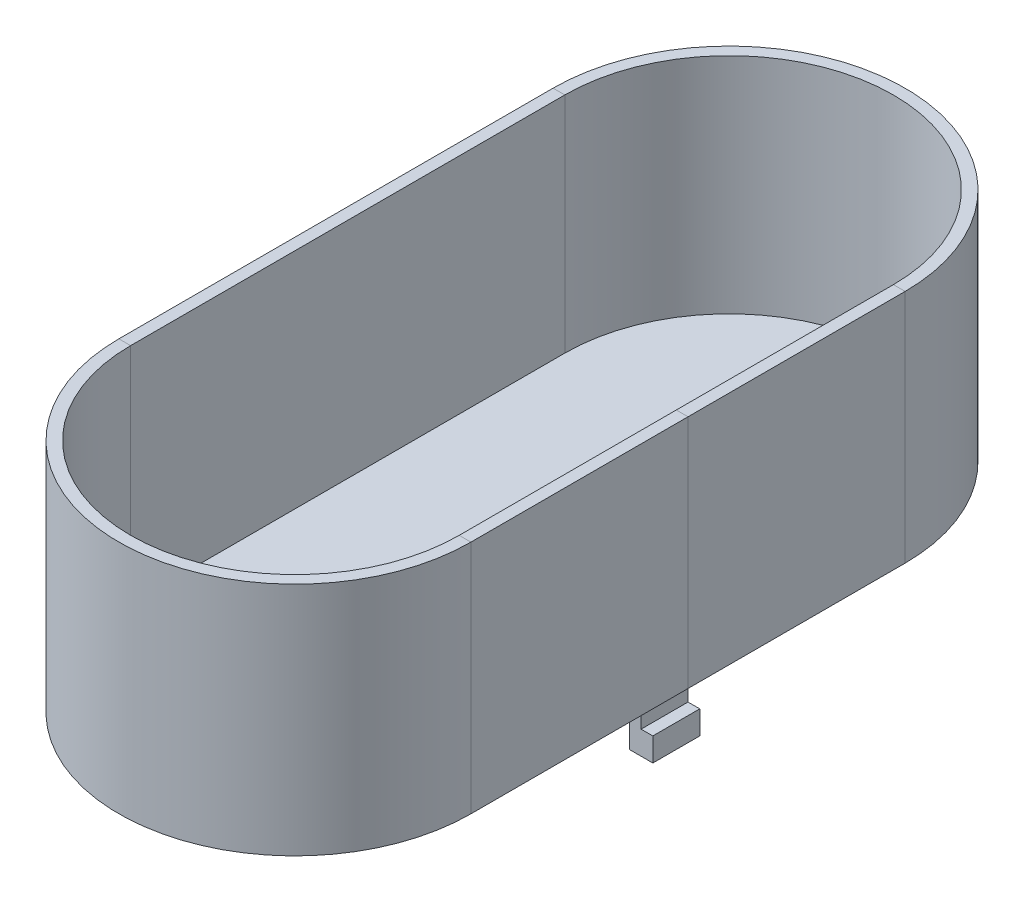
ISO-10303-21;
HEADER;
FILE_DESCRIPTION(('STEP AP214'),'2;1');
FILE_NAME('part.step','',(''),(''),'','','');
FILE_SCHEMA(('AUTOMOTIVE_DESIGN { 1 0 10303 214 1 1 1 1 }'));
ENDSEC;
DATA;
#1=APPLICATION_CONTEXT('core data for automotive mechanical design processes');
#2=APPLICATION_PROTOCOL_DEFINITION('international standard','automotive_design',2000,#1);
#3=PRODUCT_CONTEXT('',#1,'mechanical');
#4=PRODUCT('Part','Part','',(#3));
#5=PRODUCT_RELATED_PRODUCT_CATEGORY('part','',(#4));
#6=PRODUCT_DEFINITION_FORMATION('','',#4);
#7=PRODUCT_DEFINITION_CONTEXT('part definition',#1,'design');
#8=PRODUCT_DEFINITION('design','',#6,#7);
#9=PRODUCT_DEFINITION_SHAPE('','',#8);
#10=(LENGTH_UNIT() NAMED_UNIT(*) SI_UNIT(.MILLI.,.METRE.));
#11=(NAMED_UNIT(*) PLANE_ANGLE_UNIT() SI_UNIT($,.RADIAN.));
#12=(NAMED_UNIT(*) SI_UNIT($,.STERADIAN.) SOLID_ANGLE_UNIT());
#13=UNCERTAINTY_MEASURE_WITH_UNIT(LENGTH_MEASURE(1.E-05),#10,'distance_accuracy_value','');
#14=(GEOMETRIC_REPRESENTATION_CONTEXT(3) GLOBAL_UNCERTAINTY_ASSIGNED_CONTEXT((#13)) GLOBAL_UNIT_ASSIGNED_CONTEXT((#10,
#11,#12)) REPRESENTATION_CONTEXT('',''));
#15=CARTESIAN_POINT('',(0.,0.,0.));
#16=DIRECTION('',(0.,0.,1.));
#17=DIRECTION('',(1.,0.,0.));
#18=AXIS2_PLACEMENT_3D('',#15,#16,#17);
#19=CARTESIAN_POINT('',(15.5,10.0532050049702,18.5));
#20=DIRECTION('',(-1.,0.,0.));
#21=DIRECTION('',(0.,0.,1.));
#22=AXIS2_PLACEMENT_3D('',#19,#20,#21);
#23=PLANE('',#22);
#24=DIRECTION('',(0.,-1.,0.));
#25=VECTOR('',#24,1.);
#26=CARTESIAN_POINT('',(15.5,10.0532050049702,0.));
#27=LINE('',#26,#25);
#28=CARTESIAN_POINT('',(15.5,-9.,0.));
#29=VERTEX_POINT('',#28);
#30=CARTESIAN_POINT('',(15.5,10.0532050049702,0.));
#31=VERTEX_POINT('',#30);
#32=EDGE_CURVE('E335',#29,#31,#27,.F.);
#33=ORIENTED_EDGE('',*,*,#32,.F.);
#34=DIRECTION('',(0.,0.,1.));
#35=VECTOR('',#34,1.);
#36=CARTESIAN_POINT('',(15.5,-9.,0.));
#37=LINE('',#36,#35);
#38=CARTESIAN_POINT('',(15.5,-9.,18.5));
#39=VERTEX_POINT('',#38);
#40=EDGE_CURVE('E311',#29,#39,#37,.T.);
#41=ORIENTED_EDGE('',*,*,#40,.T.);
#42=DIRECTION('',(0.,-1.,0.));
#43=VECTOR('',#42,1.);
#44=CARTESIAN_POINT('',(15.5,10.0532050049702,18.5));
#45=LINE('',#44,#43);
#46=CARTESIAN_POINT('',(15.5,10.0532050049702,18.5));
#47=VERTEX_POINT('',#46);
#48=EDGE_CURVE('E48',#39,#47,#45,.F.);
#49=ORIENTED_EDGE('',*,*,#48,.T.);
#50=DIRECTION('',(0.,0.,-1.));
#51=VECTOR('',#50,1.);
#52=CARTESIAN_POINT('',(15.5,10.0532050049702,18.5));
#53=LINE('',#52,#51);
#54=EDGE_CURVE('E370',#47,#31,#53,.T.);
#55=ORIENTED_EDGE('',*,*,#54,.T.);
#56=EDGE_LOOP('',(#33,#41,#49,#55));
#57=FACE_BOUND('',#56,.T.);
#58=ADVANCED_FACE('F45',(#57),#23,.T.);
#59=CARTESIAN_POINT('',(1.5,0.,18.5));
#60=DIRECTION('',(0.,1.,0.));
#61=DIRECTION('',(0.,0.,1.));
#62=AXIS2_PLACEMENT_3D('',#59,#60,#61);
#63=CYLINDRICAL_SURFACE('',#62,14.);
#64=ORIENTED_EDGE('',*,*,#48,.F.);
#65=CARTESIAN_POINT('',(1.5,-9.,18.5));
#66=DIRECTION('',(0.,-1.,0.));
#67=DIRECTION('',(0.,0.,-1.));
#68=AXIS2_PLACEMENT_3D('',#65,#66,#67);
#69=CIRCLE('',#68,14.);
#70=CARTESIAN_POINT('',(-12.5,-9.,18.5));
#71=VERTEX_POINT('',#70);
#72=EDGE_CURVE('E315',#39,#71,#69,.T.);
#73=ORIENTED_EDGE('',*,*,#72,.T.);
#74=DIRECTION('',(0.,-1.,0.));
#75=VECTOR('',#74,1.);
#76=CARTESIAN_POINT('',(-12.5,10.0532050049702,18.5));
#77=LINE('',#76,#75);
#78=CARTESIAN_POINT('',(-12.5,10.0532050049702,18.5));
#79=VERTEX_POINT('',#78);
#80=EDGE_CURVE('E368',#71,#79,#77,.F.);
#81=ORIENTED_EDGE('',*,*,#80,.T.);
#82=CARTESIAN_POINT('',(1.5,10.0532050049702,18.5));
#83=DIRECTION('',(0.,1.,0.));
#84=DIRECTION('',(-1.,0.,0.));
#85=AXIS2_PLACEMENT_3D('',#82,#83,#84);
#86=CIRCLE('',#85,14.);
#87=EDGE_CURVE('E362',#79,#47,#86,.T.);
#88=ORIENTED_EDGE('',*,*,#87,.T.);
#89=EDGE_LOOP('',(#64,#73,#81,#88));
#90=FACE_BOUND('',#89,.T.);
#91=ADVANCED_FACE('F408',(#90),#63,.F.);
#92=CARTESIAN_POINT('',(-12.5,10.0532050049702,-18.5));
#93=DIRECTION('',(1.,0.,0.));
#94=DIRECTION('',(0.,1.,0.));
#95=AXIS2_PLACEMENT_3D('',#92,#93,#94);
#96=PLANE('',#95);
#97=ORIENTED_EDGE('',*,*,#80,.F.);
#98=DIRECTION('',(0.,0.,-1.));
#99=VECTOR('',#98,1.);
#100=CARTESIAN_POINT('',(-12.5,-9.,-18.5));
#101=LINE('',#100,#99);
#102=CARTESIAN_POINT('',(-12.5,-9.,-18.5));
#103=VERTEX_POINT('',#102);
#104=EDGE_CURVE('E318',#71,#103,#101,.T.);
#105=ORIENTED_EDGE('',*,*,#104,.T.);
#106=DIRECTION('',(0.,-1.,0.));
#107=VECTOR('',#106,1.);
#108=CARTESIAN_POINT('',(-12.5,10.0532050049702,-18.5));
#109=LINE('',#108,#107);
#110=CARTESIAN_POINT('',(-12.5,10.0532050049702,-18.5));
#111=VERTEX_POINT('',#110);
#112=EDGE_CURVE('E357',#103,#111,#109,.F.);
#113=ORIENTED_EDGE('',*,*,#112,.T.);
#114=DIRECTION('',(0.,0.,1.));
#115=VECTOR('',#114,1.);
#116=CARTESIAN_POINT('',(-12.5,10.0532050049702,-18.5));
#117=LINE('',#116,#115);
#118=EDGE_CURVE('E354',#111,#79,#117,.T.);
#119=ORIENTED_EDGE('',*,*,#118,.T.);
#120=EDGE_LOOP('',(#97,#105,#113,#119));
#121=FACE_BOUND('',#120,.T.);
#122=ADVANCED_FACE('F412',(#121),#96,.T.);
#123=CARTESIAN_POINT('',(1.5,0.,-18.5));
#124=DIRECTION('',(0.,1.,0.));
#125=DIRECTION('',(0.,0.,1.));
#126=AXIS2_PLACEMENT_3D('',#123,#124,#125);
#127=CYLINDRICAL_SURFACE('',#126,14.);
#128=ORIENTED_EDGE('',*,*,#112,.F.);
#129=CARTESIAN_POINT('',(1.5,-9.,-18.5));
#130=DIRECTION('',(0.,-1.,0.));
#131=DIRECTION('',(0.,0.,-1.));
#132=AXIS2_PLACEMENT_3D('',#129,#130,#131);
#133=CIRCLE('',#132,14.);
#134=CARTESIAN_POINT('',(15.5,-9.,-18.5));
#135=VERTEX_POINT('',#134);
#136=EDGE_CURVE('E219',#103,#135,#133,.T.);
#137=ORIENTED_EDGE('',*,*,#136,.T.);
#138=DIRECTION('',(0.,-1.,0.));
#139=VECTOR('',#138,1.);
#140=CARTESIAN_POINT('',(15.5,10.0532050049702,-18.5));
#141=LINE('',#140,#139);
#142=CARTESIAN_POINT('',(15.5,10.0532050049702,-18.5));
#143=VERTEX_POINT('',#142);
#144=EDGE_CURVE('E346',#135,#143,#141,.F.);
#145=ORIENTED_EDGE('',*,*,#144,.T.);
#146=CARTESIAN_POINT('',(1.5,10.0532050049702,-18.5));
#147=DIRECTION('',(0.,1.,0.));
#148=DIRECTION('',(1.,0.,0.));
#149=AXIS2_PLACEMENT_3D('',#146,#147,#148);
#150=CIRCLE('',#149,14.);
#151=EDGE_CURVE('E340',#143,#111,#150,.T.);
#152=ORIENTED_EDGE('',*,*,#151,.T.);
#153=EDGE_LOOP('',(#128,#137,#145,#152));
#154=FACE_BOUND('',#153,.T.);
#155=ADVANCED_FACE('F455',(#154),#127,.F.);
#156=CARTESIAN_POINT('',(15.5,10.0532050049702,0.));
#157=DIRECTION('',(-1.,0.,0.));
#158=DIRECTION('',(0.,0.,1.));
#159=AXIS2_PLACEMENT_3D('',#156,#157,#158);
#160=PLANE('',#159);
#161=ORIENTED_EDGE('',*,*,#144,.F.);
#162=EDGE_CURVE('E312',#135,#29,#37,.T.);
#163=ORIENTED_EDGE('',*,*,#162,.T.);
#164=ORIENTED_EDGE('',*,*,#32,.T.);
#165=DIRECTION('',(0.,0.,-1.));
#166=VECTOR('',#165,1.);
#167=CARTESIAN_POINT('',(15.5,10.0532050049702,0.));
#168=LINE('',#167,#166);
#169=EDGE_CURVE('E329',#31,#143,#168,.T.);
#170=ORIENTED_EDGE('',*,*,#169,.T.);
#171=EDGE_LOOP('',(#161,#163,#164,#170));
#172=FACE_BOUND('',#171,.T.);
#173=ADVANCED_FACE('F458',(#172),#160,.T.);
#174=CARTESIAN_POINT('',(16.5,10.0532050049703,18.5));
#175=DIRECTION('',(1.,0.,0.));
#176=DIRECTION('',(0.,1.,0.));
#177=AXIS2_PLACEMENT_3D('',#174,#175,#176);
#178=PLANE('',#177);
#179=DIRECTION('',(0.,0.,-1.));
#180=VECTOR('',#179,1.);
#181=CARTESIAN_POINT('',(16.5,10.0532050049703,18.5));
#182=LINE('',#181,#180);
#183=CARTESIAN_POINT('',(16.5,10.0532050049703,18.5));
#184=VERTEX_POINT('',#183);
#185=CARTESIAN_POINT('',(16.5,10.0532050049703,0.));
#186=VERTEX_POINT('',#185);
#187=EDGE_CURVE('E53',#184,#186,#182,.T.);
#188=ORIENTED_EDGE('',*,*,#187,.F.);
#189=DIRECTION('',(0.,-1.,0.));
#190=VECTOR('',#189,1.);
#191=CARTESIAN_POINT('',(16.5,10.0532050049703,18.5));
#192=LINE('',#191,#190);
#193=CARTESIAN_POINT('',(16.5,-10.,18.5));
#194=VERTEX_POINT('',#193);
#195=EDGE_CURVE('E365',#184,#194,#192,.T.);
#196=ORIENTED_EDGE('',*,*,#195,.T.);
#197=DIRECTION('',(0.,0.,-1.));
#198=VECTOR('',#197,1.);
#199=CARTESIAN_POINT('',(16.5,-10.,18.5));
#200=LINE('',#199,#198);
#201=CARTESIAN_POINT('',(16.5,-10.,0.));
#202=VERTEX_POINT('',#201);
#203=EDGE_CURVE('E11',#194,#202,#200,.T.);
#204=ORIENTED_EDGE('',*,*,#203,.T.);
#205=DIRECTION('',(0.,-1.,0.));
#206=VECTOR('',#205,1.);
#207=CARTESIAN_POINT('',(16.5,10.0532050049703,0.));
#208=LINE('',#207,#206);
#209=EDGE_CURVE('E324',#186,#202,#208,.T.);
#210=ORIENTED_EDGE('',*,*,#209,.F.);
#211=EDGE_LOOP('',(#188,#196,#204,#210));
#212=FACE_BOUND('',#211,.T.);
#213=ADVANCED_FACE('F436',(#212),#178,.T.);
#214=CARTESIAN_POINT('',(1.5,0.,18.5));
#215=DIRECTION('',(0.,1.,0.));
#216=DIRECTION('',(0.,0.,1.));
#217=AXIS2_PLACEMENT_3D('',#214,#215,#216);
#218=CYLINDRICAL_SURFACE('',#217,15.);
#219=CARTESIAN_POINT('',(1.5,-10.,18.5));
#220=DIRECTION('',(0.,1.,0.));
#221=DIRECTION('',(-1.,0.,0.));
#222=AXIS2_PLACEMENT_3D('',#219,#220,#221);
#223=CIRCLE('',#222,15.);
#224=CARTESIAN_POINT('',(-13.5,-10.,18.5));
#225=VERTEX_POINT('',#224);
#226=EDGE_CURVE('E394',#225,#194,#223,.T.);
#227=ORIENTED_EDGE('',*,*,#226,.T.);
#228=ORIENTED_EDGE('',*,*,#195,.F.);
#229=CARTESIAN_POINT('',(1.5,10.0532050049703,18.5));
#230=DIRECTION('',(0.,1.,0.));
#231=DIRECTION('',(-1.,0.,0.));
#232=AXIS2_PLACEMENT_3D('',#229,#230,#231);
#233=CIRCLE('',#232,15.);
#234=CARTESIAN_POINT('',(-13.5,10.0532050049703,18.5));
#235=VERTEX_POINT('',#234);
#236=EDGE_CURVE('E361',#235,#184,#233,.T.);
#237=ORIENTED_EDGE('',*,*,#236,.F.);
#238=DIRECTION('',(0.,-1.,0.));
#239=VECTOR('',#238,1.);
#240=CARTESIAN_POINT('',(-13.5,10.0532050049703,18.5));
#241=LINE('',#240,#239);
#242=EDGE_CURVE('E350',#235,#225,#241,.T.);
#243=ORIENTED_EDGE('',*,*,#242,.T.);
#244=EDGE_LOOP('',(#227,#228,#237,#243));
#245=FACE_BOUND('',#244,.T.);
#246=ADVANCED_FACE('F427',(#245),#218,.T.);
#247=CARTESIAN_POINT('',(-12.5,10.0532050049702,18.5));
#248=DIRECTION('',(0.,1.,0.));
#249=DIRECTION('',(0.,0.,1.));
#250=AXIS2_PLACEMENT_3D('',#247,#248,#249);
#251=PLANE('',#250);
#252=ORIENTED_EDGE('',*,*,#236,.T.);
#253=DIRECTION('',(1.,0.,0.));
#254=VECTOR('',#253,1.);
#255=CARTESIAN_POINT('',(15.5,10.0532050049702,18.5));
#256=LINE('',#255,#254);
#257=EDGE_CURVE('E358',#47,#184,#256,.T.);
#258=ORIENTED_EDGE('',*,*,#257,.F.);
#259=ORIENTED_EDGE('',*,*,#87,.F.);
#260=DIRECTION('',(-1.,0.,0.));
#261=VECTOR('',#260,1.);
#262=CARTESIAN_POINT('',(-12.5,10.0532050049702,18.5));
#263=LINE('',#262,#261);
#264=EDGE_CURVE('E347',#79,#235,#263,.T.);
#265=ORIENTED_EDGE('',*,*,#264,.T.);
#266=EDGE_LOOP('',(#252,#258,#259,#265));
#267=FACE_BOUND('',#266,.T.);
#268=ADVANCED_FACE('F419',(#267),#251,.T.);
#269=CARTESIAN_POINT('',(-13.5,10.0532050049703,-18.5));
#270=DIRECTION('',(-1.,0.,0.));
#271=DIRECTION('',(0.,-1.,0.));
#272=AXIS2_PLACEMENT_3D('',#269,#270,#271);
#273=PLANE('',#272);
#274=DIRECTION('',(0.,0.,1.));
#275=VECTOR('',#274,1.);
#276=CARTESIAN_POINT('',(-13.5,-10.,-18.5));
#277=LINE('',#276,#275);
#278=CARTESIAN_POINT('',(-13.5,-10.,-18.5));
#279=VERTEX_POINT('',#278);
#280=EDGE_CURVE('E351',#279,#225,#277,.T.);
#281=ORIENTED_EDGE('',*,*,#280,.T.);
#282=ORIENTED_EDGE('',*,*,#242,.F.);
#283=DIRECTION('',(0.,0.,1.));
#284=VECTOR('',#283,1.);
#285=CARTESIAN_POINT('',(-13.5,10.0532050049703,-18.5));
#286=LINE('',#285,#284);
#287=CARTESIAN_POINT('',(-13.5,10.0532050049703,-18.5));
#288=VERTEX_POINT('',#287);
#289=EDGE_CURVE('E352',#288,#235,#286,.T.);
#290=ORIENTED_EDGE('',*,*,#289,.F.);
#291=DIRECTION('',(0.,-1.,0.));
#292=VECTOR('',#291,1.);
#293=CARTESIAN_POINT('',(-13.5,10.0532050049703,-18.5));
#294=LINE('',#293,#292);
#295=EDGE_CURVE('E343',#288,#279,#294,.T.);
#296=ORIENTED_EDGE('',*,*,#295,.T.);
#297=EDGE_LOOP('',(#281,#282,#290,#296));
#298=FACE_BOUND('',#297,.T.);
#299=ADVANCED_FACE('F428',(#298),#273,.T.);
#300=CARTESIAN_POINT('',(-12.5,10.0532050049702,-18.5));
#301=DIRECTION('',(0.,1.,0.));
#302=DIRECTION('',(-1.,0.,0.));
#303=AXIS2_PLACEMENT_3D('',#300,#301,#302);
#304=PLANE('',#303);
#305=ORIENTED_EDGE('',*,*,#289,.T.);
#306=ORIENTED_EDGE('',*,*,#264,.F.);
#307=ORIENTED_EDGE('',*,*,#118,.F.);
#308=DIRECTION('',(-1.,0.,0.));
#309=VECTOR('',#308,1.);
#310=CARTESIAN_POINT('',(-12.5,10.0532050049702,-18.5));
#311=LINE('',#310,#309);
#312=EDGE_CURVE('E336',#111,#288,#311,.T.);
#313=ORIENTED_EDGE('',*,*,#312,.T.);
#314=EDGE_LOOP('',(#305,#306,#307,#313));
#315=FACE_BOUND('',#314,.T.);
#316=ADVANCED_FACE('F420',(#315),#304,.T.);
#317=CARTESIAN_POINT('',(1.5,0.,-18.5));
#318=DIRECTION('',(0.,1.,0.));
#319=DIRECTION('',(0.,0.,1.));
#320=AXIS2_PLACEMENT_3D('',#317,#318,#319);
#321=CYLINDRICAL_SURFACE('',#320,15.);
#322=CARTESIAN_POINT('',(1.5,-10.,-18.5));
#323=DIRECTION('',(0.,1.,0.));
#324=DIRECTION('',(1.,0.,0.));
#325=AXIS2_PLACEMENT_3D('',#322,#323,#324);
#326=CIRCLE('',#325,15.);
#327=CARTESIAN_POINT('',(16.5,-10.,-18.5));
#328=VERTEX_POINT('',#327);
#329=EDGE_CURVE('E384',#328,#279,#326,.T.);
#330=ORIENTED_EDGE('',*,*,#329,.T.);
#331=ORIENTED_EDGE('',*,*,#295,.F.);
#332=CARTESIAN_POINT('',(1.5,10.0532050049703,-18.5));
#333=DIRECTION('',(0.,1.,0.));
#334=DIRECTION('',(1.,0.,0.));
#335=AXIS2_PLACEMENT_3D('',#332,#333,#334);
#336=CIRCLE('',#335,15.);
#337=CARTESIAN_POINT('',(16.5,10.0532050049703,-18.5));
#338=VERTEX_POINT('',#337);
#339=EDGE_CURVE('E339',#338,#288,#336,.T.);
#340=ORIENTED_EDGE('',*,*,#339,.F.);
#341=DIRECTION('',(0.,-1.,0.));
#342=VECTOR('',#341,1.);
#343=CARTESIAN_POINT('',(16.5,10.0532050049703,-18.5));
#344=LINE('',#343,#342);
#345=EDGE_CURVE('E332',#338,#328,#344,.T.);
#346=ORIENTED_EDGE('',*,*,#345,.T.);
#347=EDGE_LOOP('',(#330,#331,#340,#346));
#348=FACE_BOUND('',#347,.T.);
#349=ADVANCED_FACE('F498',(#348),#321,.T.);
#350=CARTESIAN_POINT('',(15.5,10.0532050049702,-18.5));
#351=DIRECTION('',(0.,1.,0.));
#352=DIRECTION('',(0.,0.,1.));
#353=AXIS2_PLACEMENT_3D('',#350,#351,#352);
#354=PLANE('',#353);
#355=ORIENTED_EDGE('',*,*,#339,.T.);
#356=ORIENTED_EDGE('',*,*,#312,.F.);
#357=ORIENTED_EDGE('',*,*,#151,.F.);
#358=DIRECTION('',(1.,0.,0.));
#359=VECTOR('',#358,1.);
#360=CARTESIAN_POINT('',(15.5,10.0532050049702,-18.5));
#361=LINE('',#360,#359);
#362=EDGE_CURVE('E325',#143,#338,#361,.T.);
#363=ORIENTED_EDGE('',*,*,#362,.T.);
#364=EDGE_LOOP('',(#355,#356,#357,#363));
#365=FACE_BOUND('',#364,.T.);
#366=ADVANCED_FACE('F453',(#365),#354,.T.);
#367=CARTESIAN_POINT('',(15.5,-10.,0.));
#368=DIRECTION('',(0.,-1.,0.));
#369=DIRECTION('',(0.,0.,-1.));
#370=AXIS2_PLACEMENT_3D('',#367,#368,#369);
#371=PLANE('',#370);
#372=DIRECTION('',(1.,0.,0.));
#373=VECTOR('',#372,1.);
#374=CARTESIAN_POINT('',(0.,-10.,2.));
#375=LINE('',#374,#373);
#376=CARTESIAN_POINT('',(-11.5,-10.,2.));
#377=VERTEX_POINT('',#376);
#378=CARTESIAN_POINT('',(-10.5,-10.,2.));
#379=VERTEX_POINT('',#378);
#380=EDGE_CURVE('E230',#377,#379,#375,.T.);
#381=ORIENTED_EDGE('',*,*,#380,.T.);
#382=DIRECTION('',(0.,0.,-1.));
#383=VECTOR('',#382,1.);
#384=CARTESIAN_POINT('',(-10.5,-10.,2.));
#385=LINE('',#384,#383);
#386=CARTESIAN_POINT('',(-10.5,-10.,-2.));
#387=VERTEX_POINT('',#386);
#388=EDGE_CURVE('E261',#379,#387,#385,.T.);
#389=ORIENTED_EDGE('',*,*,#388,.T.);
#390=DIRECTION('',(1.,0.,0.));
#391=VECTOR('',#390,1.);
#392=CARTESIAN_POINT('',(0.,-10.,-2.));
#393=LINE('',#392,#391);
#394=CARTESIAN_POINT('',(-11.5,-10.,-2.));
#395=VERTEX_POINT('',#394);
#396=EDGE_CURVE('E232',#395,#387,#393,.T.);
#397=ORIENTED_EDGE('',*,*,#396,.F.);
#398=DIRECTION('',(0.,0.,-1.));
#399=VECTOR('',#398,1.);
#400=CARTESIAN_POINT('',(-11.5,-10.,2.));
#401=LINE('',#400,#399);
#402=EDGE_CURVE('E245',#377,#395,#401,.T.);
#403=ORIENTED_EDGE('',*,*,#402,.F.);
#404=EDGE_LOOP('',(#381,#389,#397,#403));
#405=FACE_BOUND('',#404,.T.);
#406=DIRECTION('',(-1.,0.,0.));
#407=VECTOR('',#406,1.);
#408=CARTESIAN_POINT('',(0.,-10.,2.));
#409=LINE('',#408,#407);
#410=CARTESIAN_POINT('',(14.5,-10.,2.));
#411=VERTEX_POINT('',#410);
#412=CARTESIAN_POINT('',(13.5,-10.,2.));
#413=VERTEX_POINT('',#412);
#414=EDGE_CURVE('E278',#411,#413,#409,.T.);
#415=ORIENTED_EDGE('',*,*,#414,.F.);
#416=DIRECTION('',(0.,0.,-1.));
#417=VECTOR('',#416,1.);
#418=CARTESIAN_POINT('',(14.5,-10.,2.));
#419=LINE('',#418,#417);
#420=CARTESIAN_POINT('',(14.5,-10.,-2.));
#421=VERTEX_POINT('',#420);
#422=EDGE_CURVE('E299',#411,#421,#419,.T.);
#423=ORIENTED_EDGE('',*,*,#422,.T.);
#424=DIRECTION('',(-1.,0.,0.));
#425=VECTOR('',#424,1.);
#426=CARTESIAN_POINT('',(0.,-10.,-2.));
#427=LINE('',#426,#425);
#428=CARTESIAN_POINT('',(13.5,-10.,-2.));
#429=VERTEX_POINT('',#428);
#430=EDGE_CURVE('E292',#421,#429,#427,.T.);
#431=ORIENTED_EDGE('',*,*,#430,.T.);
#432=DIRECTION('',(0.,0.,-1.));
#433=VECTOR('',#432,1.);
#434=CARTESIAN_POINT('',(13.5,-10.,2.));
#435=LINE('',#434,#433);
#436=EDGE_CURVE('E297',#413,#429,#435,.T.);
#437=ORIENTED_EDGE('',*,*,#436,.F.);
#438=EDGE_LOOP('',(#415,#423,#431,#437));
#439=FACE_BOUND('',#438,.T.);
#440=DIRECTION('',(0.,0.,-1.));
#441=VECTOR('',#440,1.);
#442=CARTESIAN_POINT('',(16.5,-10.,0.));
#443=LINE('',#442,#441);
#444=EDGE_CURVE('E378',#202,#328,#443,.T.);
#445=ORIENTED_EDGE('',*,*,#444,.F.);
#446=ORIENTED_EDGE('',*,*,#203,.F.);
#447=ORIENTED_EDGE('',*,*,#226,.F.);
#448=ORIENTED_EDGE('',*,*,#280,.F.);
#449=ORIENTED_EDGE('',*,*,#329,.F.);
#450=EDGE_LOOP('',(#445,#446,#447,#448,#449));
#451=FACE_BOUND('',#450,.T.);
#452=ADVANCED_FACE('F434',(#405,#439,#451),#371,.T.);
#453=CARTESIAN_POINT('',(16.5,10.0532050049703,0.));
#454=DIRECTION('',(1.,0.,0.));
#455=DIRECTION('',(0.,1.,0.));
#456=AXIS2_PLACEMENT_3D('',#453,#454,#455);
#457=PLANE('',#456);
#458=ORIENTED_EDGE('',*,*,#444,.T.);
#459=ORIENTED_EDGE('',*,*,#345,.F.);
#460=DIRECTION('',(0.,0.,-1.));
#461=VECTOR('',#460,1.);
#462=CARTESIAN_POINT('',(16.5,10.0532050049703,0.));
#463=LINE('',#462,#461);
#464=EDGE_CURVE('E328',#186,#338,#463,.T.);
#465=ORIENTED_EDGE('',*,*,#464,.F.);
#466=ORIENTED_EDGE('',*,*,#209,.T.);
#467=EDGE_LOOP('',(#458,#459,#465,#466));
#468=FACE_BOUND('',#467,.T.);
#469=ADVANCED_FACE('F446',(#468),#457,.T.);
#470=CARTESIAN_POINT('',(15.5,10.0532050049702,0.));
#471=DIRECTION('',(0.,1.,0.));
#472=DIRECTION('',(-1.,0.,0.));
#473=AXIS2_PLACEMENT_3D('',#470,#471,#472);
#474=PLANE('',#473);
#475=ORIENTED_EDGE('',*,*,#464,.T.);
#476=ORIENTED_EDGE('',*,*,#362,.F.);
#477=ORIENTED_EDGE('',*,*,#169,.F.);
#478=DIRECTION('',(1.,0.,0.));
#479=VECTOR('',#478,1.);
#480=CARTESIAN_POINT('',(15.5,10.0532050049702,0.));
#481=LINE('',#480,#479);
#482=EDGE_CURVE('E321',#31,#186,#481,.T.);
#483=ORIENTED_EDGE('',*,*,#482,.T.);
#484=EDGE_LOOP('',(#475,#476,#477,#483));
#485=FACE_BOUND('',#484,.T.);
#486=ADVANCED_FACE('F449',(#485),#474,.T.);
#487=CARTESIAN_POINT('',(15.5,10.0532050049702,18.5));
#488=DIRECTION('',(0.,1.,0.));
#489=DIRECTION('',(-1.,0.,0.));
#490=AXIS2_PLACEMENT_3D('',#487,#488,#489);
#491=PLANE('',#490);
#492=ORIENTED_EDGE('',*,*,#257,.T.);
#493=ORIENTED_EDGE('',*,*,#187,.T.);
#494=ORIENTED_EDGE('',*,*,#482,.F.);
#495=ORIENTED_EDGE('',*,*,#54,.F.);
#496=EDGE_LOOP('',(#492,#493,#494,#495));
#497=FACE_BOUND('',#496,.T.);
#498=ADVANCED_FACE('F442',(#497),#491,.T.);
#499=CARTESIAN_POINT('',(1.5,-9.,-18.5));
#500=DIRECTION('',(0.,-1.,0.));
#501=DIRECTION('',(0.,0.,-1.));
#502=AXIS2_PLACEMENT_3D('',#499,#500,#501);
#503=PLANE('',#502);
#504=ORIENTED_EDGE('',*,*,#136,.F.);
#505=ORIENTED_EDGE('',*,*,#104,.F.);
#506=ORIENTED_EDGE('',*,*,#72,.F.);
#507=ORIENTED_EDGE('',*,*,#40,.F.);
#508=ORIENTED_EDGE('',*,*,#162,.F.);
#509=EDGE_LOOP('',(#504,#505,#506,#507,#508));
#510=FACE_BOUND('',#509,.T.);
#511=ADVANCED_FACE('F463',(#510),#503,.F.);
#512=CARTESIAN_POINT('',(0.,-15.,2.));
#513=DIRECTION('',(0.,-1.,0.));
#514=DIRECTION('',(0.,0.,-1.));
#515=AXIS2_PLACEMENT_3D('',#512,#513,#514);
#516=PLANE('',#515);
#517=DIRECTION('',(-1.,0.,0.));
#518=VECTOR('',#517,1.);
#519=CARTESIAN_POINT('',(0.,-15.,-2.));
#520=LINE('',#519,#518);
#521=CARTESIAN_POINT('',(15.5,-15.,-2.));
#522=VERTEX_POINT('',#521);
#523=CARTESIAN_POINT('',(13.5,-15.,-2.));
#524=VERTEX_POINT('',#523);
#525=EDGE_CURVE('E284',#522,#524,#520,.T.);
#526=ORIENTED_EDGE('',*,*,#525,.F.);
#527=DIRECTION('',(0.,0.,-1.));
#528=VECTOR('',#527,1.);
#529=CARTESIAN_POINT('',(15.5,-15.,2.));
#530=LINE('',#529,#528);
#531=CARTESIAN_POINT('',(15.5,-15.,2.));
#532=VERTEX_POINT('',#531);
#533=EDGE_CURVE('E248',#532,#522,#530,.T.);
#534=ORIENTED_EDGE('',*,*,#533,.F.);
#535=DIRECTION('',(-1.,0.,0.));
#536=VECTOR('',#535,1.);
#537=CARTESIAN_POINT('',(0.,-15.,2.));
#538=LINE('',#537,#536);
#539=CARTESIAN_POINT('',(13.5,-15.,2.));
#540=VERTEX_POINT('',#539);
#541=EDGE_CURVE('E269',#532,#540,#538,.T.);
#542=ORIENTED_EDGE('',*,*,#541,.T.);
#543=DIRECTION('',(0.,0.,-1.));
#544=VECTOR('',#543,1.);
#545=CARTESIAN_POINT('',(13.5,-15.,2.));
#546=LINE('',#545,#544);
#547=EDGE_CURVE('E283',#540,#524,#546,.T.);
#548=ORIENTED_EDGE('',*,*,#547,.T.);
#549=EDGE_LOOP('',(#526,#534,#542,#548));
#550=FACE_BOUND('',#549,.T.);
#551=ADVANCED_FACE('F465',(#550),#516,.T.);
#552=CARTESIAN_POINT('',(15.5,0.,2.));
#553=DIRECTION('',(-1.,0.,0.));
#554=DIRECTION('',(0.,0.,1.));
#555=AXIS2_PLACEMENT_3D('',#552,#553,#554);
#556=PLANE('',#555);
#557=DIRECTION('',(0.,1.,0.));
#558=VECTOR('',#557,1.);
#559=CARTESIAN_POINT('',(15.5,0.,-2.));
#560=LINE('',#559,#558);
#561=CARTESIAN_POINT('',(15.5,-13.,-2.));
#562=VERTEX_POINT('',#561);
#563=EDGE_CURVE('E286',#522,#562,#560,.T.);
#564=ORIENTED_EDGE('',*,*,#563,.T.);
#565=DIRECTION('',(0.,0.,-1.));
#566=VECTOR('',#565,1.);
#567=CARTESIAN_POINT('',(15.5,-13.,2.));
#568=LINE('',#567,#566);
#569=CARTESIAN_POINT('',(15.5,-13.,2.));
#570=VERTEX_POINT('',#569);
#571=EDGE_CURVE('E305',#570,#562,#568,.T.);
#572=ORIENTED_EDGE('',*,*,#571,.F.);
#573=DIRECTION('',(0.,1.,0.));
#574=VECTOR('',#573,1.);
#575=CARTESIAN_POINT('',(15.5,0.,2.));
#576=LINE('',#575,#574);
#577=EDGE_CURVE('E272',#532,#570,#576,.T.);
#578=ORIENTED_EDGE('',*,*,#577,.F.);
#579=ORIENTED_EDGE('',*,*,#533,.T.);
#580=EDGE_LOOP('',(#564,#572,#578,#579));
#581=FACE_BOUND('',#580,.T.);
#582=ADVANCED_FACE('F472',(#581),#556,.F.);
#583=CARTESIAN_POINT('',(0.,-13.,2.));
#584=DIRECTION('',(0.,-1.,0.));
#585=DIRECTION('',(0.,0.,-1.));
#586=AXIS2_PLACEMENT_3D('',#583,#584,#585);
#587=PLANE('',#586);
#588=DIRECTION('',(-1.,0.,0.));
#589=VECTOR('',#588,1.);
#590=CARTESIAN_POINT('',(0.,-13.,-2.));
#591=LINE('',#590,#589);
#592=CARTESIAN_POINT('',(14.5,-13.,-2.));
#593=VERTEX_POINT('',#592);
#594=EDGE_CURVE('E288',#562,#593,#591,.T.);
#595=ORIENTED_EDGE('',*,*,#594,.T.);
#596=DIRECTION('',(0.,0.,-1.));
#597=VECTOR('',#596,1.);
#598=CARTESIAN_POINT('',(14.5,-13.,2.));
#599=LINE('',#598,#597);
#600=CARTESIAN_POINT('',(14.5,-13.,2.));
#601=VERTEX_POINT('',#600);
#602=EDGE_CURVE('E302',#601,#593,#599,.T.);
#603=ORIENTED_EDGE('',*,*,#602,.F.);
#604=DIRECTION('',(-1.,0.,0.));
#605=VECTOR('',#604,1.);
#606=CARTESIAN_POINT('',(0.,-13.,2.));
#607=LINE('',#606,#605);
#608=EDGE_CURVE('E274',#570,#601,#607,.T.);
#609=ORIENTED_EDGE('',*,*,#608,.F.);
#610=ORIENTED_EDGE('',*,*,#571,.T.);
#611=EDGE_LOOP('',(#595,#603,#609,#610));
#612=FACE_BOUND('',#611,.T.);
#613=ADVANCED_FACE('F583',(#612),#587,.F.);
#614=CARTESIAN_POINT('',(14.5,0.,2.));
#615=DIRECTION('',(-1.,0.,0.));
#616=DIRECTION('',(0.,0.,1.));
#617=AXIS2_PLACEMENT_3D('',#614,#615,#616);
#618=PLANE('',#617);
#619=DIRECTION('',(0.,1.,0.));
#620=VECTOR('',#619,1.);
#621=CARTESIAN_POINT('',(14.5,0.,-2.));
#622=LINE('',#621,#620);
#623=EDGE_CURVE('E290',#593,#421,#622,.T.);
#624=ORIENTED_EDGE('',*,*,#623,.T.);
#625=ORIENTED_EDGE('',*,*,#422,.F.);
#626=DIRECTION('',(0.,1.,0.));
#627=VECTOR('',#626,1.);
#628=CARTESIAN_POINT('',(14.5,0.,2.));
#629=LINE('',#628,#627);
#630=EDGE_CURVE('E276',#601,#411,#629,.T.);
#631=ORIENTED_EDGE('',*,*,#630,.F.);
#632=ORIENTED_EDGE('',*,*,#602,.T.);
#633=EDGE_LOOP('',(#624,#625,#631,#632));
#634=FACE_BOUND('',#633,.T.);
#635=ADVANCED_FACE('F593',(#634),#618,.F.);
#636=CARTESIAN_POINT('',(13.5,0.,2.));
#637=DIRECTION('',(-1.,0.,0.));
#638=DIRECTION('',(0.,0.,1.));
#639=AXIS2_PLACEMENT_3D('',#636,#637,#638);
#640=PLANE('',#639);
#641=DIRECTION('',(0.,1.,0.));
#642=VECTOR('',#641,1.);
#643=CARTESIAN_POINT('',(13.5,0.,-2.));
#644=LINE('',#643,#642);
#645=EDGE_CURVE('E69',#524,#429,#644,.T.);
#646=ORIENTED_EDGE('',*,*,#645,.F.);
#647=ORIENTED_EDGE('',*,*,#547,.F.);
#648=DIRECTION('',(0.,1.,0.));
#649=VECTOR('',#648,1.);
#650=CARTESIAN_POINT('',(13.5,0.,2.));
#651=LINE('',#650,#649);
#652=EDGE_CURVE('E280',#540,#413,#651,.T.);
#653=ORIENTED_EDGE('',*,*,#652,.T.);
#654=ORIENTED_EDGE('',*,*,#436,.T.);
#655=EDGE_LOOP('',(#646,#647,#653,#654));
#656=FACE_BOUND('',#655,.T.);
#657=ADVANCED_FACE('F603',(#656),#640,.T.);
#658=CARTESIAN_POINT('',(0.,0.,2.));
#659=DIRECTION('',(0.,0.,1.));
#660=DIRECTION('',(1.,0.,0.));
#661=AXIS2_PLACEMENT_3D('',#658,#659,#660);
#662=PLANE('',#661);
#663=ORIENTED_EDGE('',*,*,#541,.F.);
#664=ORIENTED_EDGE('',*,*,#577,.T.);
#665=ORIENTED_EDGE('',*,*,#608,.T.);
#666=ORIENTED_EDGE('',*,*,#630,.T.);
#667=ORIENTED_EDGE('',*,*,#414,.T.);
#668=ORIENTED_EDGE('',*,*,#652,.F.);
#669=EDGE_LOOP('',(#663,#664,#665,#666,#667,#668));
#670=FACE_BOUND('',#669,.T.);
#671=ADVANCED_FACE('F613',(#670),#662,.T.);
#672=CARTESIAN_POINT('',(0.,0.,-2.));
#673=DIRECTION('',(0.,0.,1.));
#674=DIRECTION('',(1.,0.,0.));
#675=AXIS2_PLACEMENT_3D('',#672,#673,#674);
#676=PLANE('',#675);
#677=ORIENTED_EDGE('',*,*,#525,.T.);
#678=ORIENTED_EDGE('',*,*,#645,.T.);
#679=ORIENTED_EDGE('',*,*,#430,.F.);
#680=ORIENTED_EDGE('',*,*,#623,.F.);
#681=ORIENTED_EDGE('',*,*,#594,.F.);
#682=ORIENTED_EDGE('',*,*,#563,.F.);
#683=EDGE_LOOP('',(#677,#678,#679,#680,#681,#682));
#684=FACE_BOUND('',#683,.T.);
#685=ADVANCED_FACE('F626',(#684),#676,.F.);
#686=CARTESIAN_POINT('',(-11.5,0.,2.));
#687=DIRECTION('',(-1.,0.,0.));
#688=DIRECTION('',(0.,0.,1.));
#689=AXIS2_PLACEMENT_3D('',#686,#687,#688);
#690=PLANE('',#689);
#691=DIRECTION('',(0.,1.,0.));
#692=VECTOR('',#691,1.);
#693=CARTESIAN_POINT('',(-11.5,0.,-2.));
#694=LINE('',#693,#692);
#695=CARTESIAN_POINT('',(-11.5,-13.,-2.));
#696=VERTEX_POINT('',#695);
#697=EDGE_CURVE('E61',#696,#395,#694,.T.);
#698=ORIENTED_EDGE('',*,*,#697,.F.);
#699=DIRECTION('',(0.,0.,-1.));
#700=VECTOR('',#699,1.);
#701=CARTESIAN_POINT('',(-11.5,-13.,2.));
#702=LINE('',#701,#700);
#703=CARTESIAN_POINT('',(-11.5,-13.,2.));
#704=VERTEX_POINT('',#703);
#705=EDGE_CURVE('E211',#704,#696,#702,.T.);
#706=ORIENTED_EDGE('',*,*,#705,.F.);
#707=DIRECTION('',(0.,1.,0.));
#708=VECTOR('',#707,1.);
#709=CARTESIAN_POINT('',(-11.5,0.,2.));
#710=LINE('',#709,#708);
#711=EDGE_CURVE('E214',#704,#377,#710,.T.);
#712=ORIENTED_EDGE('',*,*,#711,.T.);
#713=ORIENTED_EDGE('',*,*,#402,.T.);
#714=EDGE_LOOP('',(#698,#706,#712,#713));
#715=FACE_BOUND('',#714,.T.);
#716=ADVANCED_FACE('F213',(#715),#690,.T.);
#717=CARTESIAN_POINT('',(0.,-13.,2.));
#718=DIRECTION('',(0.,1.,0.));
#719=DIRECTION('',(0.,0.,1.));
#720=AXIS2_PLACEMENT_3D('',#717,#718,#719);
#721=PLANE('',#720);
#722=DIRECTION('',(1.,0.,0.));
#723=VECTOR('',#722,1.);
#724=CARTESIAN_POINT('',(0.,-13.,-2.));
#725=LINE('',#724,#723);
#726=CARTESIAN_POINT('',(-12.5,-13.,-2.));
#727=VERTEX_POINT('',#726);
#728=EDGE_CURVE('E247',#727,#696,#725,.T.);
#729=ORIENTED_EDGE('',*,*,#728,.F.);
#730=DIRECTION('',(0.,0.,-1.));
#731=VECTOR('',#730,1.);
#732=CARTESIAN_POINT('',(-12.5,-13.,2.));
#733=LINE('',#732,#731);
#734=CARTESIAN_POINT('',(-12.5,-13.,2.));
#735=VERTEX_POINT('',#734);
#736=EDGE_CURVE('E220',#735,#727,#733,.T.);
#737=ORIENTED_EDGE('',*,*,#736,.F.);
#738=DIRECTION('',(1.,0.,0.));
#739=VECTOR('',#738,1.);
#740=CARTESIAN_POINT('',(0.,-13.,2.));
#741=LINE('',#740,#739);
#742=EDGE_CURVE('E226',#735,#704,#741,.T.);
#743=ORIENTED_EDGE('',*,*,#742,.T.);
#744=ORIENTED_EDGE('',*,*,#705,.T.);
#745=EDGE_LOOP('',(#729,#737,#743,#744));
#746=FACE_BOUND('',#745,.T.);
#747=ADVANCED_FACE('F234',(#746),#721,.T.);
#748=CARTESIAN_POINT('',(-12.5,0.,2.));
#749=DIRECTION('',(-1.,0.,0.));
#750=DIRECTION('',(0.,0.,1.));
#751=AXIS2_PLACEMENT_3D('',#748,#749,#750);
#752=PLANE('',#751);
#753=DIRECTION('',(0.,1.,0.));
#754=VECTOR('',#753,1.);
#755=CARTESIAN_POINT('',(-12.5,0.,-2.));
#756=LINE('',#755,#754);
#757=CARTESIAN_POINT('',(-12.5,-15.,-2.));
#758=VERTEX_POINT('',#757);
#759=EDGE_CURVE('E250',#758,#727,#756,.T.);
#760=ORIENTED_EDGE('',*,*,#759,.F.);
#761=DIRECTION('',(0.,0.,-1.));
#762=VECTOR('',#761,1.);
#763=CARTESIAN_POINT('',(-12.5,-15.,2.));
#764=LINE('',#763,#762);
#765=CARTESIAN_POINT('',(-12.5,-15.,2.));
#766=VERTEX_POINT('',#765);
#767=EDGE_CURVE('E266',#766,#758,#764,.T.);
#768=ORIENTED_EDGE('',*,*,#767,.F.);
#769=DIRECTION('',(0.,1.,0.));
#770=VECTOR('',#769,1.);
#771=CARTESIAN_POINT('',(-12.5,0.,2.));
#772=LINE('',#771,#770);
#773=EDGE_CURVE('E235',#766,#735,#772,.T.);
#774=ORIENTED_EDGE('',*,*,#773,.T.);
#775=ORIENTED_EDGE('',*,*,#736,.T.);
#776=EDGE_LOOP('',(#760,#768,#774,#775));
#777=FACE_BOUND('',#776,.T.);
#778=ADVANCED_FACE('F652',(#777),#752,.T.);
#779=CARTESIAN_POINT('',(0.,-15.,2.));
#780=DIRECTION('',(0.,1.,0.));
#781=DIRECTION('',(0.,0.,1.));
#782=AXIS2_PLACEMENT_3D('',#779,#780,#781);
#783=PLANE('',#782);
#784=DIRECTION('',(1.,0.,0.));
#785=VECTOR('',#784,1.);
#786=CARTESIAN_POINT('',(0.,-15.,-2.));
#787=LINE('',#786,#785);
#788=CARTESIAN_POINT('',(-10.5,-15.,-2.));
#789=VERTEX_POINT('',#788);
#790=EDGE_CURVE('E253',#758,#789,#787,.T.);
#791=ORIENTED_EDGE('',*,*,#790,.T.);
#792=DIRECTION('',(0.,0.,-1.));
#793=VECTOR('',#792,1.);
#794=CARTESIAN_POINT('',(-10.5,-15.,2.));
#795=LINE('',#794,#793);
#796=CARTESIAN_POINT('',(-10.5,-15.,2.));
#797=VERTEX_POINT('',#796);
#798=EDGE_CURVE('E264',#797,#789,#795,.T.);
#799=ORIENTED_EDGE('',*,*,#798,.F.);
#800=DIRECTION('',(1.,0.,0.));
#801=VECTOR('',#800,1.);
#802=CARTESIAN_POINT('',(0.,-15.,2.));
#803=LINE('',#802,#801);
#804=EDGE_CURVE('E237',#766,#797,#803,.T.);
#805=ORIENTED_EDGE('',*,*,#804,.F.);
#806=ORIENTED_EDGE('',*,*,#767,.T.);
#807=EDGE_LOOP('',(#791,#799,#805,#806));
#808=FACE_BOUND('',#807,.T.);
#809=ADVANCED_FACE('F661',(#808),#783,.F.);
#810=CARTESIAN_POINT('',(-10.5,0.,2.));
#811=DIRECTION('',(1.,0.,0.));
#812=DIRECTION('',(0.,0.,-1.));
#813=AXIS2_PLACEMENT_3D('',#810,#811,#812);
#814=PLANE('',#813);
#815=DIRECTION('',(0.,-1.,0.));
#816=VECTOR('',#815,1.);
#817=CARTESIAN_POINT('',(-10.5,0.,-2.));
#818=LINE('',#817,#816);
#819=EDGE_CURVE('E256',#387,#789,#818,.T.);
#820=ORIENTED_EDGE('',*,*,#819,.F.);
#821=ORIENTED_EDGE('',*,*,#388,.F.);
#822=DIRECTION('',(0.,-1.,0.));
#823=VECTOR('',#822,1.);
#824=CARTESIAN_POINT('',(-10.5,0.,2.));
#825=LINE('',#824,#823);
#826=EDGE_CURVE('E241',#379,#797,#825,.T.);
#827=ORIENTED_EDGE('',*,*,#826,.T.);
#828=ORIENTED_EDGE('',*,*,#798,.T.);
#829=EDGE_LOOP('',(#820,#821,#827,#828));
#830=FACE_BOUND('',#829,.T.);
#831=ADVANCED_FACE('F671',(#830),#814,.T.);
#832=CARTESIAN_POINT('',(0.,0.,2.));
#833=DIRECTION('',(0.,0.,1.));
#834=DIRECTION('',(1.,0.,0.));
#835=AXIS2_PLACEMENT_3D('',#832,#833,#834);
#836=PLANE('',#835);
#837=ORIENTED_EDGE('',*,*,#711,.F.);
#838=ORIENTED_EDGE('',*,*,#742,.F.);
#839=ORIENTED_EDGE('',*,*,#773,.F.);
#840=ORIENTED_EDGE('',*,*,#804,.T.);
#841=ORIENTED_EDGE('',*,*,#826,.F.);
#842=ORIENTED_EDGE('',*,*,#380,.F.);
#843=EDGE_LOOP('',(#837,#838,#839,#840,#841,#842));
#844=FACE_BOUND('',#843,.T.);
#845=ADVANCED_FACE('F224',(#844),#836,.T.);
#846=CARTESIAN_POINT('',(0.,0.,-2.));
#847=DIRECTION('',(0.,0.,1.));
#848=DIRECTION('',(1.,0.,0.));
#849=AXIS2_PLACEMENT_3D('',#846,#847,#848);
#850=PLANE('',#849);
#851=ORIENTED_EDGE('',*,*,#697,.T.);
#852=ORIENTED_EDGE('',*,*,#396,.T.);
#853=ORIENTED_EDGE('',*,*,#819,.T.);
#854=ORIENTED_EDGE('',*,*,#790,.F.);
#855=ORIENTED_EDGE('',*,*,#759,.T.);
#856=ORIENTED_EDGE('',*,*,#728,.T.);
#857=EDGE_LOOP('',(#851,#852,#853,#854,#855,#856));
#858=FACE_BOUND('',#857,.T.);
#859=ADVANCED_FACE('F693',(#858),#850,.F.);
#860=CLOSED_SHELL('',(#58,#91,#122,#155,#173,#213,#246,#268,#299,#316,#349,#366,#452,#469,#486,
#498,#511,#551,#582,#613,#635,#657,#671,#685,#716,#747,#778,#809,#831,#845,#859));
#861=MANIFOLD_SOLID_BREP('B2',#860);
#862=ADVANCED_BREP_SHAPE_REPRESENTATION('',(#18,#861),#14);
#863=SHAPE_DEFINITION_REPRESENTATION(#9,#862);
ENDSEC;
END-ISO-10303-21;
